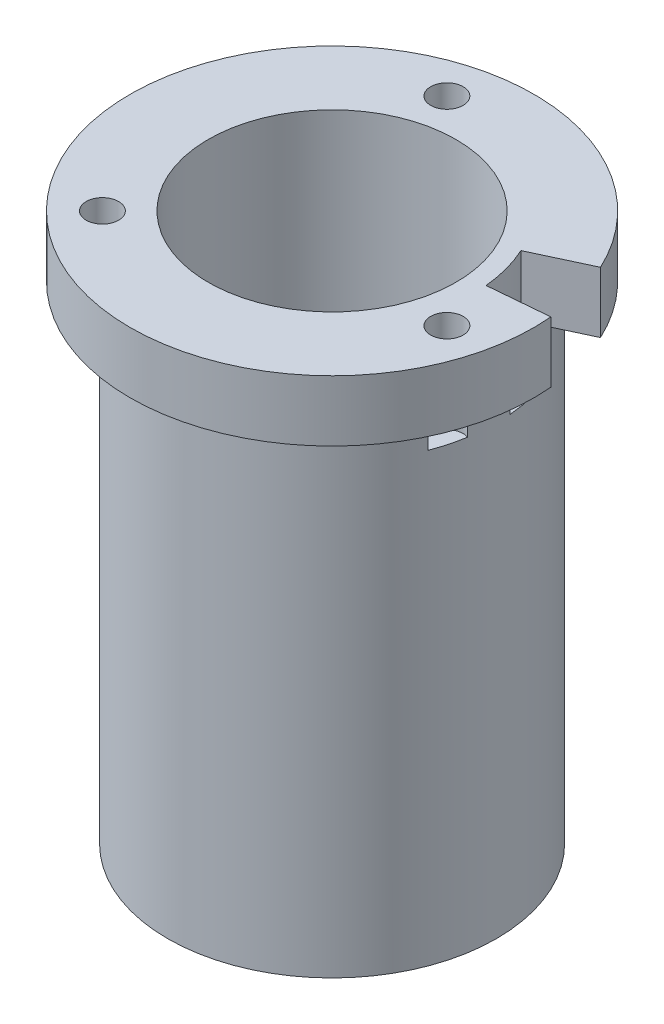
ISO-10303-21;
HEADER;
FILE_DESCRIPTION(('STEP AP214'),'2;1');
FILE_NAME('part.step','',(''),(''),'','','');
FILE_SCHEMA(('AUTOMOTIVE_DESIGN { 1 0 10303 214 1 1 1 1 }'));
ENDSEC;
DATA;
#1=APPLICATION_CONTEXT('core data for automotive mechanical design processes');
#2=APPLICATION_PROTOCOL_DEFINITION('international standard','automotive_design',2000,#1);
#3=PRODUCT_CONTEXT('',#1,'mechanical');
#4=PRODUCT('Part','Part','',(#3));
#5=PRODUCT_RELATED_PRODUCT_CATEGORY('part','',(#4));
#6=PRODUCT_DEFINITION_FORMATION('','',#4);
#7=PRODUCT_DEFINITION_CONTEXT('part definition',#1,'design');
#8=PRODUCT_DEFINITION('design','',#6,#7);
#9=PRODUCT_DEFINITION_SHAPE('','',#8);
#10=(LENGTH_UNIT() NAMED_UNIT(*) SI_UNIT(.MILLI.,.METRE.));
#11=(NAMED_UNIT(*) PLANE_ANGLE_UNIT() SI_UNIT($,.RADIAN.));
#12=(NAMED_UNIT(*) SI_UNIT($,.STERADIAN.) SOLID_ANGLE_UNIT());
#13=UNCERTAINTY_MEASURE_WITH_UNIT(LENGTH_MEASURE(1.E-05),#10,'distance_accuracy_value','');
#14=(GEOMETRIC_REPRESENTATION_CONTEXT(3) GLOBAL_UNCERTAINTY_ASSIGNED_CONTEXT((#13)) GLOBAL_UNIT_ASSIGNED_CONTEXT((#10,
#11,#12)) REPRESENTATION_CONTEXT('',''));
#15=CARTESIAN_POINT('',(0.,0.,0.));
#16=DIRECTION('',(0.,0.,1.));
#17=DIRECTION('',(1.,0.,0.));
#18=AXIS2_PLACEMENT_3D('',#15,#16,#17);
#19=CARTESIAN_POINT('',(0.,0.,0.));
#20=DIRECTION('',(0.,-1.,0.));
#21=DIRECTION('',(0.,0.,-1.));
#22=AXIS2_PLACEMENT_3D('',#19,#20,#21);
#23=CYLINDRICAL_SURFACE('',#22,6.1);
#24=CARTESIAN_POINT('',(0.,0.,0.));
#25=DIRECTION('',(0.,-1.,0.));
#26=DIRECTION('',(0.,0.,-1.));
#27=AXIS2_PLACEMENT_3D('',#24,#25,#26);
#28=CIRCLE('',#27,6.1);
#29=CARTESIAN_POINT('',(0.,0.,-6.1));
#30=VERTEX_POINT('',#29);
#31=EDGE_CURVE('E215',#30,#30,#28,.T.);
#32=ORIENTED_EDGE('',*,*,#31,.T.);
#33=EDGE_LOOP('',(#32));
#34=FACE_BOUND('',#33,.T.);
#35=CARTESIAN_POINT('',(0.,27.,0.));
#36=DIRECTION('',(0.,-1.,0.));
#37=DIRECTION('',(0.,0.,-1.));
#38=AXIS2_PLACEMENT_3D('',#35,#36,#37);
#39=CIRCLE('',#38,6.09999999999999);
#40=CARTESIAN_POINT('',(0.,27.,-6.09999999999999));
#41=VERTEX_POINT('',#40);
#42=EDGE_CURVE('E198',#41,#41,#39,.T.);
#43=ORIENTED_EDGE('',*,*,#42,.F.);
#44=EDGE_LOOP('',(#43));
#45=FACE_BOUND('',#44,.T.);
#46=ADVANCED_FACE('F32',(#34,#45),#23,.F.);
#47=CARTESIAN_POINT('',(6.1,0.,0.));
#48=DIRECTION('',(0.,-1.,0.));
#49=DIRECTION('',(0.,0.,-1.));
#50=AXIS2_PLACEMENT_3D('',#47,#48,#49);
#51=PLANE('',#50);
#52=CARTESIAN_POINT('',(0.,0.,0.));
#53=DIRECTION('',(0.,-1.,0.));
#54=DIRECTION('',(0.,0.,-1.));
#55=AXIS2_PLACEMENT_3D('',#52,#53,#54);
#56=CIRCLE('',#55,8.1);
#57=CARTESIAN_POINT('',(0.,0.,-8.1));
#58=VERTEX_POINT('',#57);
#59=EDGE_CURVE('E211',#58,#58,#56,.T.);
#60=ORIENTED_EDGE('',*,*,#59,.T.);
#61=EDGE_LOOP('',(#60));
#62=FACE_BOUND('',#61,.T.);
#63=ORIENTED_EDGE('',*,*,#31,.F.);
#64=EDGE_LOOP('',(#63));
#65=FACE_BOUND('',#64,.T.);
#66=ADVANCED_FACE('F256',(#62,#65),#51,.T.);
#67=CARTESIAN_POINT('',(0.,0.,0.));
#68=DIRECTION('',(0.,-1.,0.));
#69=DIRECTION('',(0.,0.,-1.));
#70=AXIS2_PLACEMENT_3D('',#67,#68,#69);
#71=CYLINDRICAL_SURFACE('',#70,8.1);
#72=DIRECTION('',(0.,1.,0.));
#73=VECTOR('',#72,1.);
#74=CARTESIAN_POINT('',(-1.31572464587927,24.5,-7.99242570539294));
#75=LINE('',#74,#73);
#76=CARTESIAN_POINT('',(-1.31572464587927,24.,-7.99242570539294));
#77=VERTEX_POINT('',#76);
#78=CARTESIAN_POINT('',(-1.31572464587927,22.,-7.99242570539294));
#79=VERTEX_POINT('',#78);
#80=EDGE_CURVE('E120',#77,#79,#75,.F.);
#81=ORIENTED_EDGE('',*,*,#80,.F.);
#82=CARTESIAN_POINT('',(0.,24.,0.));
#83=DIRECTION('',(0.,-1.,0.));
#84=DIRECTION('',(0.,0.,-1.));
#85=AXIS2_PLACEMENT_3D('',#82,#83,#84);
#86=CIRCLE('',#85,8.1);
#87=CARTESIAN_POINT('',(7.34109307499686,24.,-3.42320792009967));
#88=VERTEX_POINT('',#87);
#89=EDGE_CURVE('E212',#77,#88,#86,.T.);
#90=ORIENTED_EDGE('',*,*,#89,.T.);
#91=DIRECTION('',(0.,-1.,0.));
#92=VECTOR('',#91,1.);
#93=CARTESIAN_POINT('',(7.34109307499686,0.,-3.42320792009967));
#94=LINE('',#93,#92);
#95=CARTESIAN_POINT('',(7.34109307499686,22.,-3.42320792009967));
#96=VERTEX_POINT('',#95);
#97=EDGE_CURVE('E176',#96,#88,#94,.F.);
#98=ORIENTED_EDGE('',*,*,#97,.F.);
#99=CARTESIAN_POINT('',(0.,22.,0.));
#100=DIRECTION('',(0.,1.,0.));
#101=DIRECTION('',(0.,0.,1.));
#102=AXIS2_PLACEMENT_3D('',#99,#100,#101);
#103=CIRCLE('',#102,8.1);
#104=CARTESIAN_POINT('',(8.06917705454314,22.,-0.705961516256032));
#105=VERTEX_POINT('',#104);
#106=EDGE_CURVE('E223',#96,#105,#103,.F.);
#107=ORIENTED_EDGE('',*,*,#106,.T.);
#108=DIRECTION('',(0.,-1.,0.));
#109=VECTOR('',#108,1.);
#110=CARTESIAN_POINT('',(8.06917705454314,0.,-0.705961516256032));
#111=LINE('',#110,#109);
#112=CARTESIAN_POINT('',(8.06917705454314,24.,-0.705961516256032));
#113=VERTEX_POINT('',#112);
#114=EDGE_CURVE('E183',#113,#105,#111,.T.);
#115=ORIENTED_EDGE('',*,*,#114,.F.);
#116=CARTESIAN_POINT('',(7.99242570539293,24.,1.31572464587936));
#117=VERTEX_POINT('',#116);
#118=EDGE_CURVE('E207',#113,#117,#86,.T.);
#119=ORIENTED_EDGE('',*,*,#118,.T.);
#120=DIRECTION('',(0.,1.,0.));
#121=VECTOR('',#120,1.);
#122=CARTESIAN_POINT('',(7.99242570539293,24.5,1.31572464587935));
#123=LINE('',#122,#121);
#124=CARTESIAN_POINT('',(7.99242570539293,22.,1.31572464587935));
#125=VERTEX_POINT('',#124);
#126=EDGE_CURVE('E193',#125,#117,#123,.T.);
#127=ORIENTED_EDGE('',*,*,#126,.F.);
#128=CARTESIAN_POINT('',(0.,22.,0.));
#129=DIRECTION('',(0.,1.,0.));
#130=DIRECTION('',(0.,0.,1.));
#131=AXIS2_PLACEMENT_3D('',#128,#129,#130);
#132=CIRCLE('',#131,8.1);
#133=CARTESIAN_POINT('',(7.57950602166971,22.,2.85676188497967));
#134=VERTEX_POINT('',#133);
#135=EDGE_CURVE('E218',#125,#134,#132,.F.);
#136=ORIENTED_EDGE('',*,*,#135,.T.);
#137=DIRECTION('',(0.,1.,0.));
#138=VECTOR('',#137,1.);
#139=CARTESIAN_POINT('',(7.57950602166971,24.5,2.85676188497967));
#140=LINE('',#139,#138);
#141=CARTESIAN_POINT('',(7.57950602166971,24.,2.85676188497967));
#142=VERTEX_POINT('',#141);
#143=EDGE_CURVE('E196',#142,#134,#140,.F.);
#144=ORIENTED_EDGE('',*,*,#143,.F.);
#145=CARTESIAN_POINT('',(-5.1356638204133,24.,6.26378137579033));
#146=VERTEX_POINT('',#145);
#147=EDGE_CURVE('E208',#142,#146,#86,.T.);
#148=ORIENTED_EDGE('',*,*,#147,.T.);
#149=DIRECTION('',(0.,1.,0.));
#150=VECTOR('',#149,1.);
#151=CARTESIAN_POINT('',(-5.13566382041329,24.5,6.26378137579033));
#152=LINE('',#151,#150);
#153=CARTESIAN_POINT('',(-5.1356638204133,22.,6.26378137579034));
#154=VERTEX_POINT('',#153);
#155=EDGE_CURVE('E54',#154,#146,#152,.T.);
#156=ORIENTED_EDGE('',*,*,#155,.F.);
#157=CARTESIAN_POINT('',(0.,22.,0.));
#158=DIRECTION('',(0.,1.,0.));
#159=DIRECTION('',(0.,0.,1.));
#160=AXIS2_PLACEMENT_3D('',#157,#158,#159);
#161=CIRCLE('',#160,8.1);
#162=CARTESIAN_POINT('',(-6.26378137579039,22.,5.13566382041323));
#163=VERTEX_POINT('',#162);
#164=EDGE_CURVE('E39',#154,#163,#161,.F.);
#165=ORIENTED_EDGE('',*,*,#164,.T.);
#166=DIRECTION('',(0.,1.,0.));
#167=VECTOR('',#166,1.);
#168=CARTESIAN_POINT('',(-6.26378137579039,24.5,5.13566382041323));
#169=LINE('',#168,#167);
#170=CARTESIAN_POINT('',(-6.26378137579039,24.,5.13566382041323));
#171=VERTEX_POINT('',#170);
#172=EDGE_CURVE('E152',#171,#163,#169,.F.);
#173=ORIENTED_EDGE('',*,*,#172,.F.);
#174=CARTESIAN_POINT('',(-2.85676188497959,24.,-7.57950602166974));
#175=VERTEX_POINT('',#174);
#176=EDGE_CURVE('E139',#171,#175,#86,.T.);
#177=ORIENTED_EDGE('',*,*,#176,.T.);
#178=DIRECTION('',(0.,1.,0.));
#179=VECTOR('',#178,1.);
#180=CARTESIAN_POINT('',(-2.85676188497959,24.5,-7.57950602166974));
#181=LINE('',#180,#179);
#182=CARTESIAN_POINT('',(-2.85676188497959,22.,-7.57950602166974));
#183=VERTEX_POINT('',#182);
#184=EDGE_CURVE('E46',#183,#175,#181,.T.);
#185=ORIENTED_EDGE('',*,*,#184,.F.);
#186=CARTESIAN_POINT('',(0.,22.,0.));
#187=DIRECTION('',(0.,1.,0.));
#188=DIRECTION('',(0.,0.,1.));
#189=AXIS2_PLACEMENT_3D('',#186,#187,#188);
#190=CIRCLE('',#189,8.1);
#191=EDGE_CURVE('E11',#183,#79,#190,.F.);
#192=ORIENTED_EDGE('',*,*,#191,.T.);
#193=EDGE_LOOP('',(#81,#90,#98,#107,#115,#119,#127,#136,#144,#148,#156,#165,#173,#177,#185,#192));
#194=FACE_BOUND('',#193,.T.);
#195=ORIENTED_EDGE('',*,*,#59,.F.);
#196=EDGE_LOOP('',(#195));
#197=FACE_BOUND('',#196,.T.);
#198=ADVANCED_FACE('F134',(#194,#197),#71,.T.);
#199=CARTESIAN_POINT('',(8.1,24.,0.));
#200=DIRECTION('',(0.,-1.,0.));
#201=DIRECTION('',(0.,0.,-1.));
#202=AXIS2_PLACEMENT_3D('',#199,#200,#201);
#203=PLANE('',#202);
#204=CARTESIAN_POINT('',(-2.07055236082009,24.,-7.72740661031257));
#205=DIRECTION('',(0.,-1.,0.));
#206=DIRECTION('',(0.,0.,-1.));
#207=AXIS2_PLACEMENT_3D('',#204,#205,#206);
#208=CIRCLE('',#207,0.800000000000001);
#209=EDGE_CURVE('E125',#175,#77,#208,.T.);
#210=ORIENTED_EDGE('',*,*,#209,.F.);
#211=ORIENTED_EDGE('',*,*,#176,.F.);
#212=CARTESIAN_POINT('',(-5.65685424949241,24.,5.65685424949235));
#213=DIRECTION('',(0.,-1.,0.));
#214=DIRECTION('',(0.,0.,-1.));
#215=AXIS2_PLACEMENT_3D('',#212,#213,#214);
#216=CIRCLE('',#215,0.800000000000001);
#217=EDGE_CURVE('E147',#146,#171,#216,.T.);
#218=ORIENTED_EDGE('',*,*,#217,.F.);
#219=ORIENTED_EDGE('',*,*,#147,.F.);
#220=CARTESIAN_POINT('',(7.72740661031255,24.,2.07055236082017));
#221=DIRECTION('',(0.,-1.,0.));
#222=DIRECTION('',(0.,0.,-1.));
#223=AXIS2_PLACEMENT_3D('',#220,#221,#222);
#224=CIRCLE('',#223,0.800000000000001);
#225=EDGE_CURVE('E189',#117,#142,#224,.T.);
#226=ORIENTED_EDGE('',*,*,#225,.F.);
#227=ORIENTED_EDGE('',*,*,#118,.F.);
#228=DIRECTION('',(-0.996194698091746,0.,0.0871557427476583));
#229=VECTOR('',#228,1.);
#230=CARTESIAN_POINT('',(8.03847139969944,24.,-0.703275119551069));
#231=LINE('',#230,#229);
#232=CARTESIAN_POINT('',(9.91213724601286,24.,-0.8671996403392));
#233=VERTEX_POINT('',#232);
#234=EDGE_CURVE('E181',#233,#113,#231,.T.);
#235=ORIENTED_EDGE('',*,*,#234,.F.);
#236=CARTESIAN_POINT('',(0.,24.,0.));
#237=DIRECTION('',(0.,-1.,0.));
#238=DIRECTION('',(0.,0.,-1.));
#239=AXIS2_PLACEMENT_3D('',#236,#237,#238);
#240=CIRCLE('',#239,9.95);
#241=CARTESIAN_POINT('',(9.01776248101466,24.,-4.20505170431997));
#242=VERTEX_POINT('',#241);
#243=EDGE_CURVE('E204',#233,#242,#240,.T.);
#244=ORIENTED_EDGE('',*,*,#243,.T.);
#245=DIRECTION('',(0.90630778703665,0.,-0.4226182617407));
#246=VECTOR('',#245,1.);
#247=CARTESIAN_POINT('',(6.65328981923048,24.,-3.10247999463186));
#248=LINE('',#247,#246);
#249=EDGE_CURVE('E174',#88,#242,#248,.T.);
#250=ORIENTED_EDGE('',*,*,#249,.F.);
#251=ORIENTED_EDGE('',*,*,#89,.F.);
#252=EDGE_LOOP('',(#210,#211,#218,#219,#226,#227,#235,#244,#250,#251));
#253=FACE_BOUND('',#252,.T.);
#254=ADVANCED_FACE('F232',(#253),#203,.T.);
#255=CARTESIAN_POINT('',(0.,0.,0.));
#256=DIRECTION('',(0.,-1.,0.));
#257=DIRECTION('',(0.,0.,-1.));
#258=AXIS2_PLACEMENT_3D('',#255,#256,#257);
#259=CYLINDRICAL_SURFACE('',#258,9.95);
#260=DIRECTION('',(0.,-1.,0.));
#261=VECTOR('',#260,1.);
#262=CARTESIAN_POINT('',(9.91213724601286,0.,-0.8671996403392));
#263=LINE('',#262,#261);
#264=CARTESIAN_POINT('',(9.91213724601286,27.,-0.8671996403392));
#265=VERTEX_POINT('',#264);
#266=EDGE_CURVE('E179',#265,#233,#263,.T.);
#267=ORIENTED_EDGE('',*,*,#266,.F.);
#268=CARTESIAN_POINT('',(0.,27.,0.));
#269=DIRECTION('',(0.,-1.,0.));
#270=DIRECTION('',(0.,0.,-1.));
#271=AXIS2_PLACEMENT_3D('',#268,#269,#270);
#272=CIRCLE('',#271,9.95);
#273=CARTESIAN_POINT('',(9.01776248101466,27.,-4.20505170431997));
#274=VERTEX_POINT('',#273);
#275=EDGE_CURVE('E201',#265,#274,#272,.T.);
#276=ORIENTED_EDGE('',*,*,#275,.T.);
#277=DIRECTION('',(0.,-1.,0.));
#278=VECTOR('',#277,1.);
#279=CARTESIAN_POINT('',(9.01776248101466,0.,-4.20505170431997));
#280=LINE('',#279,#278);
#281=EDGE_CURVE('E170',#242,#274,#280,.F.);
#282=ORIENTED_EDGE('',*,*,#281,.F.);
#283=ORIENTED_EDGE('',*,*,#243,.F.);
#284=EDGE_LOOP('',(#267,#276,#282,#283));
#285=FACE_BOUND('',#284,.T.);
#286=ADVANCED_FACE('F267',(#285),#259,.T.);
#287=CARTESIAN_POINT('',(9.95,27.,0.));
#288=DIRECTION('',(0.,1.,0.));
#289=DIRECTION('',(0.,0.,1.));
#290=AXIS2_PLACEMENT_3D('',#287,#288,#289);
#291=PLANE('',#290);
#292=CARTESIAN_POINT('',(-2.07055236082009,27.,-7.72740661031257));
#293=DIRECTION('',(0.,1.,0.));
#294=DIRECTION('',(0.,0.,1.));
#295=AXIS2_PLACEMENT_3D('',#292,#293,#294);
#296=CIRCLE('',#295,0.800000000000001);
#297=CARTESIAN_POINT('',(-2.07055236082009,27.,-6.92740661031257));
#298=VERTEX_POINT('',#297);
#299=EDGE_CURVE('E132',#298,#298,#296,.T.);
#300=ORIENTED_EDGE('',*,*,#299,.F.);
#301=EDGE_LOOP('',(#300));
#302=FACE_BOUND('',#301,.T.);
#303=CARTESIAN_POINT('',(-5.65685424949241,27.,5.65685424949235));
#304=DIRECTION('',(0.,1.,0.));
#305=DIRECTION('',(0.,0.,1.));
#306=AXIS2_PLACEMENT_3D('',#303,#304,#305);
#307=CIRCLE('',#306,0.800000000000001);
#308=CARTESIAN_POINT('',(-5.65685424949241,27.,6.45685424949235));
#309=VERTEX_POINT('',#308);
#310=EDGE_CURVE('E128',#309,#309,#307,.T.);
#311=ORIENTED_EDGE('',*,*,#310,.F.);
#312=EDGE_LOOP('',(#311));
#313=FACE_BOUND('',#312,.T.);
#314=DIRECTION('',(0.996194698091746,0.,-0.0871557427476583));
#315=VECTOR('',#314,1.);
#316=CARTESIAN_POINT('',(6.97336288664222,27.,-0.610090199233608));
#317=LINE('',#316,#315);
#318=CARTESIAN_POINT('',(6.97336288664222,27.,-0.610090199233608));
#319=VERTEX_POINT('',#318);
#320=EDGE_CURVE('E158',#319,#265,#317,.T.);
#321=ORIENTED_EDGE('',*,*,#320,.F.);
#322=CARTESIAN_POINT('',(0.,27.,0.));
#323=DIRECTION('',(0.,-1.,0.));
#324=DIRECTION('',(0.,0.,1.));
#325=AXIS2_PLACEMENT_3D('',#322,#323,#324);
#326=CIRCLE('',#325,7.);
#327=CARTESIAN_POINT('',(6.34415450925655,27.,-2.9583278321849));
#328=VERTEX_POINT('',#327);
#329=EDGE_CURVE('E154',#328,#319,#326,.T.);
#330=ORIENTED_EDGE('',*,*,#329,.F.);
#331=DIRECTION('',(-0.90630778703665,0.,0.4226182617407));
#332=VECTOR('',#331,1.);
#333=CARTESIAN_POINT('',(8.17286835819052,27.,-3.81107110451692));
#334=LINE('',#333,#332);
#335=EDGE_CURVE('E221',#274,#328,#334,.T.);
#336=ORIENTED_EDGE('',*,*,#335,.F.);
#337=ORIENTED_EDGE('',*,*,#275,.F.);
#338=EDGE_LOOP('',(#321,#330,#336,#337));
#339=FACE_BOUND('',#338,.T.);
#340=CARTESIAN_POINT('',(7.72740661031255,27.,2.07055236082017));
#341=DIRECTION('',(0.,1.,0.));
#342=DIRECTION('',(0.,0.,1.));
#343=AXIS2_PLACEMENT_3D('',#340,#341,#342);
#344=CIRCLE('',#343,0.800000000000001);
#345=CARTESIAN_POINT('',(7.72740661031255,27.,2.87055236082017));
#346=VERTEX_POINT('',#345);
#347=EDGE_CURVE('E185',#346,#346,#344,.T.);
#348=ORIENTED_EDGE('',*,*,#347,.F.);
#349=EDGE_LOOP('',(#348));
#350=FACE_BOUND('',#349,.T.);
#351=ORIENTED_EDGE('',*,*,#42,.T.);
#352=EDGE_LOOP('',(#351));
#353=FACE_BOUND('',#352,.T.);
#354=ADVANCED_FACE('F252',(#302,#313,#339,#350,#353),#291,.T.);
#355=CARTESIAN_POINT('',(7.72740661031255,22.,2.07055236082017));
#356=DIRECTION('',(0.,1.,0.));
#357=DIRECTION('',(0.,0.,1.));
#358=AXIS2_PLACEMENT_3D('',#355,#356,#357);
#359=CYLINDRICAL_SURFACE('',#358,0.800000000000001);
#360=ORIENTED_EDGE('',*,*,#143,.T.);
#361=CARTESIAN_POINT('',(7.72740661031255,22.,2.07055236082017));
#362=DIRECTION('',(0.,1.,0.));
#363=DIRECTION('',(0.,0.,1.));
#364=AXIS2_PLACEMENT_3D('',#361,#362,#363);
#365=CIRCLE('',#364,0.800000000000001);
#366=EDGE_CURVE('E186',#125,#134,#365,.T.);
#367=ORIENTED_EDGE('',*,*,#366,.F.);
#368=ORIENTED_EDGE('',*,*,#126,.T.);
#369=ORIENTED_EDGE('',*,*,#225,.T.);
#370=EDGE_LOOP('',(#360,#367,#368,#369));
#371=FACE_BOUND('',#370,.T.);
#372=ORIENTED_EDGE('',*,*,#347,.T.);
#373=EDGE_LOOP('',(#372));
#374=FACE_BOUND('',#373,.T.);
#375=ADVANCED_FACE('F238',(#371,#374),#359,.F.);
#376=CARTESIAN_POINT('',(7.72740661031255,22.,2.07055236082017));
#377=DIRECTION('',(0.,1.,0.));
#378=DIRECTION('',(0.,0.,1.));
#379=AXIS2_PLACEMENT_3D('',#376,#377,#378);
#380=PLANE('',#379);
#381=ORIENTED_EDGE('',*,*,#366,.T.);
#382=ORIENTED_EDGE('',*,*,#135,.F.);
#383=EDGE_LOOP('',(#381,#382));
#384=FACE_BOUND('',#383,.T.);
#385=ADVANCED_FACE('F241',(#384),#380,.T.);
#386=CARTESIAN_POINT('',(6.97336288664222,22.,-0.610090199233608));
#387=DIRECTION('',(0.0871557427476583,0.,0.996194698091746));
#388=DIRECTION('',(0.996194698091746,0.,-0.0871557427476583));
#389=AXIS2_PLACEMENT_3D('',#386,#387,#388);
#390=PLANE('',#389);
#391=ORIENTED_EDGE('',*,*,#114,.T.);
#392=DIRECTION('',(0.996194698091746,0.,-0.0871557427476583));
#393=VECTOR('',#392,1.);
#394=CARTESIAN_POINT('',(6.97336288664222,22.,-0.610090199233608));
#395=LINE('',#394,#393);
#396=CARTESIAN_POINT('',(6.97336288664222,22.,-0.610090199233608));
#397=VERTEX_POINT('',#396);
#398=EDGE_CURVE('E161',#397,#105,#395,.T.);
#399=ORIENTED_EDGE('',*,*,#398,.F.);
#400=DIRECTION('',(0.,1.,0.));
#401=VECTOR('',#400,1.);
#402=CARTESIAN_POINT('',(6.97336288664222,22.,-0.610090199233608));
#403=LINE('',#402,#401);
#404=EDGE_CURVE('E168',#397,#319,#403,.T.);
#405=ORIENTED_EDGE('',*,*,#404,.T.);
#406=ORIENTED_EDGE('',*,*,#320,.T.);
#407=ORIENTED_EDGE('',*,*,#266,.T.);
#408=ORIENTED_EDGE('',*,*,#234,.T.);
#409=EDGE_LOOP('',(#391,#399,#405,#406,#407,#408));
#410=FACE_BOUND('',#409,.T.);
#411=ADVANCED_FACE('F243',(#410),#390,.F.);
#412=CARTESIAN_POINT('',(0.,22.,0.));
#413=DIRECTION('',(0.,1.,0.));
#414=DIRECTION('',(0.,0.,1.));
#415=AXIS2_PLACEMENT_3D('',#412,#413,#414);
#416=CYLINDRICAL_SURFACE('',#415,7.);
#417=ORIENTED_EDGE('',*,*,#329,.T.);
#418=ORIENTED_EDGE('',*,*,#404,.F.);
#419=CARTESIAN_POINT('',(0.,22.,0.));
#420=DIRECTION('',(0.,-1.,0.));
#421=DIRECTION('',(0.,0.,1.));
#422=AXIS2_PLACEMENT_3D('',#419,#420,#421);
#423=CIRCLE('',#422,7.);
#424=CARTESIAN_POINT('',(6.34415450925655,22.,-2.9583278321849));
#425=VERTEX_POINT('',#424);
#426=EDGE_CURVE('E157',#425,#397,#423,.T.);
#427=ORIENTED_EDGE('',*,*,#426,.F.);
#428=DIRECTION('',(0.,1.,0.));
#429=VECTOR('',#428,1.);
#430=CARTESIAN_POINT('',(6.34415450925655,22.,-2.9583278321849));
#431=LINE('',#430,#429);
#432=EDGE_CURVE('E164',#425,#328,#431,.T.);
#433=ORIENTED_EDGE('',*,*,#432,.T.);
#434=EDGE_LOOP('',(#417,#418,#427,#433));
#435=FACE_BOUND('',#434,.T.);
#436=ADVANCED_FACE('F249',(#435),#416,.T.);
#437=CARTESIAN_POINT('',(6.34415450925655,22.,-2.9583278321849));
#438=DIRECTION('',(-0.4226182617407,0.,-0.90630778703665));
#439=DIRECTION('',(-0.90630778703665,0.,0.4226182617407));
#440=AXIS2_PLACEMENT_3D('',#437,#438,#439);
#441=PLANE('',#440);
#442=ORIENTED_EDGE('',*,*,#97,.T.);
#443=ORIENTED_EDGE('',*,*,#249,.T.);
#444=ORIENTED_EDGE('',*,*,#281,.T.);
#445=ORIENTED_EDGE('',*,*,#335,.T.);
#446=ORIENTED_EDGE('',*,*,#432,.F.);
#447=DIRECTION('',(-0.90630778703665,0.,0.4226182617407));
#448=VECTOR('',#447,1.);
#449=CARTESIAN_POINT('',(6.34415450925655,22.,-2.9583278321849));
#450=LINE('',#449,#448);
#451=EDGE_CURVE('E155',#96,#425,#450,.T.);
#452=ORIENTED_EDGE('',*,*,#451,.F.);
#453=EDGE_LOOP('',(#442,#443,#444,#445,#446,#452));
#454=FACE_BOUND('',#453,.T.);
#455=ADVANCED_FACE('F323',(#454),#441,.F.);
#456=CARTESIAN_POINT('',(0.,22.,0.));
#457=DIRECTION('',(0.,1.,0.));
#458=DIRECTION('',(0.,0.,1.));
#459=AXIS2_PLACEMENT_3D('',#456,#457,#458);
#460=PLANE('',#459);
#461=ORIENTED_EDGE('',*,*,#451,.T.);
#462=ORIENTED_EDGE('',*,*,#426,.T.);
#463=ORIENTED_EDGE('',*,*,#398,.T.);
#464=ORIENTED_EDGE('',*,*,#106,.F.);
#465=EDGE_LOOP('',(#461,#462,#463,#464));
#466=FACE_BOUND('',#465,.T.);
#467=ADVANCED_FACE('F333',(#466),#460,.T.);
#468=CARTESIAN_POINT('',(-5.65685424949241,22.,5.65685424949235));
#469=DIRECTION('',(0.,1.,0.));
#470=DIRECTION('',(0.,0.,1.));
#471=AXIS2_PLACEMENT_3D('',#468,#469,#470);
#472=CYLINDRICAL_SURFACE('',#471,0.800000000000001);
#473=ORIENTED_EDGE('',*,*,#172,.T.);
#474=CARTESIAN_POINT('',(-5.65685424949241,22.,5.65685424949235));
#475=DIRECTION('',(0.,1.,0.));
#476=DIRECTION('',(0.,0.,1.));
#477=AXIS2_PLACEMENT_3D('',#474,#475,#476);
#478=CIRCLE('',#477,0.800000000000001);
#479=EDGE_CURVE('E144',#154,#163,#478,.T.);
#480=ORIENTED_EDGE('',*,*,#479,.F.);
#481=ORIENTED_EDGE('',*,*,#155,.T.);
#482=ORIENTED_EDGE('',*,*,#217,.T.);
#483=EDGE_LOOP('',(#473,#480,#481,#482));
#484=FACE_BOUND('',#483,.T.);
#485=ORIENTED_EDGE('',*,*,#310,.T.);
#486=EDGE_LOOP('',(#485));
#487=FACE_BOUND('',#486,.T.);
#488=ADVANCED_FACE('F228',(#484,#487),#472,.F.);
#489=CARTESIAN_POINT('',(-5.65685424949241,22.,5.65685424949235));
#490=DIRECTION('',(0.,1.,0.));
#491=DIRECTION('',(0.,0.,1.));
#492=AXIS2_PLACEMENT_3D('',#489,#490,#491);
#493=PLANE('',#492);
#494=ORIENTED_EDGE('',*,*,#479,.T.);
#495=ORIENTED_EDGE('',*,*,#164,.F.);
#496=EDGE_LOOP('',(#494,#495));
#497=FACE_BOUND('',#496,.T.);
#498=ADVANCED_FACE('F227',(#497),#493,.T.);
#499=CARTESIAN_POINT('',(-2.07055236082009,22.,-7.72740661031257));
#500=DIRECTION('',(0.,1.,0.));
#501=DIRECTION('',(0.,0.,1.));
#502=AXIS2_PLACEMENT_3D('',#499,#500,#501);
#503=CYLINDRICAL_SURFACE('',#502,0.800000000000001);
#504=ORIENTED_EDGE('',*,*,#80,.T.);
#505=CARTESIAN_POINT('',(-2.07055236082009,22.,-7.72740661031257));
#506=DIRECTION('',(0.,1.,0.));
#507=DIRECTION('',(0.,0.,1.));
#508=AXIS2_PLACEMENT_3D('',#505,#506,#507);
#509=CIRCLE('',#508,0.800000000000001);
#510=EDGE_CURVE('E124',#183,#79,#509,.T.);
#511=ORIENTED_EDGE('',*,*,#510,.F.);
#512=ORIENTED_EDGE('',*,*,#184,.T.);
#513=ORIENTED_EDGE('',*,*,#209,.T.);
#514=EDGE_LOOP('',(#504,#511,#512,#513));
#515=FACE_BOUND('',#514,.T.);
#516=ORIENTED_EDGE('',*,*,#299,.T.);
#517=EDGE_LOOP('',(#516));
#518=FACE_BOUND('',#517,.T.);
#519=ADVANCED_FACE('F122',(#515,#518),#503,.F.);
#520=CARTESIAN_POINT('',(-2.07055236082009,22.,-7.72740661031257));
#521=DIRECTION('',(0.,1.,0.));
#522=DIRECTION('',(0.,0.,1.));
#523=AXIS2_PLACEMENT_3D('',#520,#521,#522);
#524=PLANE('',#523);
#525=ORIENTED_EDGE('',*,*,#510,.T.);
#526=ORIENTED_EDGE('',*,*,#191,.F.);
#527=EDGE_LOOP('',(#525,#526));
#528=FACE_BOUND('',#527,.T.);
#529=ADVANCED_FACE('F131',(#528),#524,.T.);
#530=CLOSED_SHELL('',(#46,#66,#198,#254,#286,#354,#375,#385,#411,#436,#455,#467,#488,#498,#519,#529));
#531=MANIFOLD_SOLID_BREP('B2',#530);
#532=ADVANCED_BREP_SHAPE_REPRESENTATION('',(#18,#531),#14);
#533=SHAPE_DEFINITION_REPRESENTATION(#9,#532);
ENDSEC;
END-ISO-10303-21;
